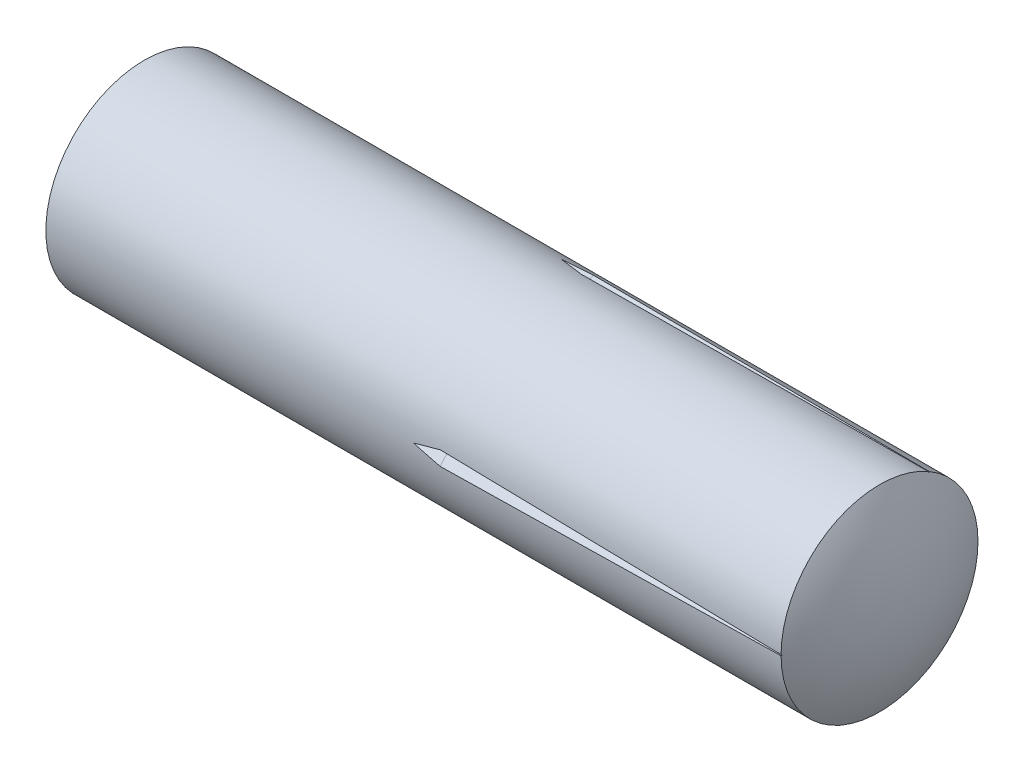
ISO-10303-21;
HEADER;
FILE_DESCRIPTION(('STEP AP214'),'2;1');
FILE_NAME('part.step','',(''),(''),'','','');
FILE_SCHEMA(('AUTOMOTIVE_DESIGN { 1 0 10303 214 1 1 1 1 }'));
ENDSEC;
DATA;
#1=APPLICATION_CONTEXT('core data for automotive mechanical design processes');
#2=APPLICATION_PROTOCOL_DEFINITION('international standard','automotive_design',2000,#1);
#3=PRODUCT_CONTEXT('',#1,'mechanical');
#4=PRODUCT('Part','Part','',(#3));
#5=PRODUCT_RELATED_PRODUCT_CATEGORY('part','',(#4));
#6=PRODUCT_DEFINITION_FORMATION('','',#4);
#7=PRODUCT_DEFINITION_CONTEXT('part definition',#1,'design');
#8=PRODUCT_DEFINITION('design','',#6,#7);
#9=PRODUCT_DEFINITION_SHAPE('','',#8);
#10=(LENGTH_UNIT() NAMED_UNIT(*) SI_UNIT(.MILLI.,.METRE.));
#11=(NAMED_UNIT(*) PLANE_ANGLE_UNIT() SI_UNIT($,.RADIAN.));
#12=(NAMED_UNIT(*) SI_UNIT($,.STERADIAN.) SOLID_ANGLE_UNIT());
#13=UNCERTAINTY_MEASURE_WITH_UNIT(LENGTH_MEASURE(1.E-05),#10,'distance_accuracy_value','');
#14=(GEOMETRIC_REPRESENTATION_CONTEXT(3) GLOBAL_UNCERTAINTY_ASSIGNED_CONTEXT((#13)) GLOBAL_UNIT_ASSIGNED_CONTEXT((#10,
#11,#12)) REPRESENTATION_CONTEXT('',''));
#15=CARTESIAN_POINT('',(0.,0.,0.));
#16=DIRECTION('',(0.,0.,1.));
#17=DIRECTION('',(1.,0.,0.));
#18=AXIS2_PLACEMENT_3D('',#15,#16,#17);
#19=CARTESIAN_POINT('',(-25.0312695557023,0.,0.));
#20=DIRECTION('',(-1.,0.,0.));
#21=DIRECTION('',(0.,1.,0.));
#22=AXIS2_PLACEMENT_3D('',#19,#20,#21);
#23=SPHERICAL_SURFACE('',#22,25.);
#24=CARTESIAN_POINT('',(-50.,0.,0.));
#25=DIRECTION('',(-1.,0.,0.));
#26=DIRECTION('',(0.,0.,1.));
#27=AXIS2_PLACEMENT_3D('',#24,#25,#26);
#28=CIRCLE('',#27,1.25);
#29=CARTESIAN_POINT('',(-50.,1.25000000000009,0.));
#30=VERTEX_POINT('',#29);
#31=EDGE_CURVE('E180',#30,#30,#28,.T.);
#32=CARTESIAN_POINT('',(-46.6819046503132,0.,0.));
#33=DIRECTION('',(-1.,0.,0.));
#34=DIRECTION('',(0.,0.,1.));
#35=AXIS2_PLACEMENT_3D('',#32,#33,#34);
#36=CIRCLE('',#35,12.5);
#37=CARTESIAN_POINT('',(-46.6819046503132,12.5,0.));
#38=VERTEX_POINT('',#37);
#39=EDGE_CURVE('E173',#38,#38,#36,.T.);
#40=CARTESIAN_POINT('',(-50.,1.25000000000009,0.));
#41=CARTESIAN_POINT('',(-49.9938336924778,1.37317333168647,0.));
#42=CARTESIAN_POINT('',(-49.9867558041352,1.49630102540885,0.));
#43=CARTESIAN_POINT('',(-49.9707787305738,1.74243819046344,0.));
#44=CARTESIAN_POINT('',(-49.9618795453548,1.86544766179563,0.));
#45=CARTESIAN_POINT('',(-49.942261742805,2.11132143560765,0.));
#46=CARTESIAN_POINT('',(-49.931543125474,2.23418573808748,0.));
#47=CARTESIAN_POINT('',(-49.9082888288313,2.47974226646468,0.));
#48=CARTESIAN_POINT('',(-49.8957531495194,2.60243449236206,0.));
#49=CARTESIAN_POINT('',(-49.8688674683718,2.84761999567275,0.));
#50=CARTESIAN_POINT('',(-49.854517466536,2.97011327308608,0.));
#51=CARTESIAN_POINT('',(-49.8240062848361,3.21487405159798,0.));
#52=CARTESIAN_POINT('',(-49.8078451049719,3.33714155269656,0.));
#53=CARTESIAN_POINT('',(-49.7737151063308,3.58142400006337,0.));
#54=CARTESIAN_POINT('',(-49.7557462875539,3.70343894633159,0.));
#55=CARTESIAN_POINT('',(-49.718004946655,3.94718956087127,0.));
#56=CARTESIAN_POINT('',(-49.698232424533,4.06892522914272,0.));
#57=CARTESIAN_POINT('',(-49.6568880074031,4.31209062567909,0.));
#58=CARTESIAN_POINT('',(-49.6353161123952,4.433520353944,0.));
#59=CARTESIAN_POINT('',(-49.5903776740829,4.67604727546572,0.));
#60=CARTESIAN_POINT('',(-49.5670111307785,4.79714446872253,0.));
#61=CARTESIAN_POINT('',(-49.5184885135079,5.03897979805612,0.));
#62=CARTESIAN_POINT('',(-49.4933324395417,5.15971793413291,0.));
#63=CARTESIAN_POINT('',(-49.4412362705202,5.40080870557385,0.));
#64=CARTESIAN_POINT('',(-49.414296175465,5.521161340938,0.));
#65=CARTESIAN_POINT('',(-49.3586378645657,5.76145475185168,0.));
#66=CARTESIAN_POINT('',(-49.3299196487216,5.8813955274012,0.));
#67=CARTESIAN_POINT('',(-49.2707113859815,6.12083894978735,0.));
#68=CARTESIAN_POINT('',(-49.2402213390854,6.24034159662397,0.));
#69=CARTESIAN_POINT('',(-49.1774760920364,6.47888258864305,0.));
#70=CARTESIAN_POINT('',(-49.1452208918834,6.59792093382551,0.));
#71=CARTESIAN_POINT('',(-49.078952402712,6.83550725128431,0.));
#72=CARTESIAN_POINT('',(-49.0449391136935,6.95405522356064,0.));
#73=CARTESIAN_POINT('',(-48.9751618962311,7.19063483135451,0.));
#74=CARTESIAN_POINT('',(-48.9393979677872,7.30866646687205,0.));
#75=CARTESIAN_POINT('',(-48.8661273043316,7.54418755038149,0.));
#76=CARTESIAN_POINT('',(-48.8286205693198,7.66167699837338,0.));
#77=CARTESIAN_POINT('',(-48.7518725072875,7.89608797481216,0.));
#78=CARTESIAN_POINT('',(-48.712631180267,8.01300950325904,0.));
#79=CARTESIAN_POINT('',(-48.6324225286792,8.24625903297168,0.));
#80=CARTESIAN_POINT('',(-48.5914552041119,8.36258703423744,0.));
#81=CARTESIAN_POINT('',(-48.5078035299129,8.59462403194338,0.));
#82=CARTESIAN_POINT('',(-48.4651191802811,8.71033302838357,0.));
#83=CARTESIAN_POINT('',(-48.3780428044906,8.94110667436572,0.));
#84=CARTESIAN_POINT('',(-48.3336507783319,9.05617132390769,0.));
#85=CARTESIAN_POINT('',(-48.2431687720324,9.28563107514239,0.));
#86=CARTESIAN_POINT('',(-48.1970787918916,9.40002617683512,0.));
#87=CARTESIAN_POINT('',(-48.1032109720534,9.62812177806314,0.));
#88=CARTESIAN_POINT('',(-48.055433132356,9.74182227759843,0.));
#89=CARTESIAN_POINT('',(-47.9582000574885,9.96850377232686,0.));
#90=CARTESIAN_POINT('',(-47.9087448223184,10.08148476752,0.));
#91=CARTESIAN_POINT('',(-47.8081677879997,10.3067025089814,0.));
#92=CARTESIAN_POINT('',(-47.7570459888512,10.4189392552497,0.));
#93=CARTESIAN_POINT('',(-47.653147022944,10.6426439172087,0.));
#94=CARTESIAN_POINT('',(-47.6003698561855,10.7541118328994,0.));
#95=CARTESIAN_POINT('',(-47.4931717144603,10.9762544207054,0.));
#96=CARTESIAN_POINT('',(-47.4387507394937,11.0869290928207,0.));
#97=CARTESIAN_POINT('',(-47.3282768989746,11.307460953207,0.));
#98=CARTESIAN_POINT('',(-47.272224033422,11.417318141478,0.));
#99=CARTESIAN_POINT('',(-47.1584986934783,11.6361909766944,0.));
#100=CARTESIAN_POINT('',(-47.1008262190871,11.7452066236399,0.));
#101=CARTESIAN_POINT('',(-46.9838742728691,11.9623724890545,0.));
#102=CARTESIAN_POINT('',(-46.9245948010422,12.0705227075236,0.));
#103=CARTESIAN_POINT('',(-46.8044419168537,12.2859340705523,0.));
#104=CARTESIAN_POINT('',(-46.743568504492,12.3931952151119,0.));
#105=CARTESIAN_POINT('',(-46.6819046503132,12.5,0.));
#106=B_SPLINE_CURVE_WITH_KNOTS('',3,(#40,#41,#42,#43,#44,#45,#46,#47,#48,#49,#50,#51,#52,#53,
#54,#55,#56,#57,#58,#59,#60,#61,#62,#63,#64,#65,#66,#67,#68,#69,#70,#71,#72,#73,#74,#75,#76,#77,
#78,#79,#80,#81,#82,#83,#84,#85,#86,#87,#88,#89,#90,#91,#92,#93,#94,#95,#96,#97,#98,#99,#100,
#101,#102,#103,#104,#105),.UNSPECIFIED.,.F.,.F.,(4,2,2,2,2,2,2,2,2,2,2,2,2,2,2,2,2,2,2,2,2,2,2,
2,2,2,2,2,2,2,2,2,4),(0.,0.369979372671549,0.739958745343092,1.10993811801464,1.47991749068618,
1.84989686335773,2.21987623602928,2.58985560870083,2.95983498137237,3.32981435404392,
3.69979372671547,4.06977309938701,4.43975247205856,4.8097318447301,5.17971121740165,
5.5496905900732,5.91966996274475,6.28964933541629,6.65962870808784,7.02960808075939,
7.39958745343093,7.76956682610248,8.13954619877402,8.50952557144557,8.87950494411712,
9.24948431678867,9.61946368946021,9.98944306213176,10.3594224348033,10.7294018074748,
11.0993811801464,11.4693605528179,11.8393399254895),.UNSPECIFIED.);
#107=EDGE_CURVE('BSEAM35',#30,#38,#106,.T.);
#108=ORIENTED_EDGE('',*,*,#31,.F.);
#109=ORIENTED_EDGE('',*,*,#39,.T.);
#110=ORIENTED_EDGE('',*,*,#107,.T.);
#111=ORIENTED_EDGE('',*,*,#107,.F.);
#112=EDGE_LOOP('',(#108,#110,#109,#111));
#113=FACE_BOUND('',#112,.T.);
#114=ADVANCED_FACE('F35',(#113),#23,.T.);
#115=CARTESIAN_POINT('',(-50.,0.,0.));
#116=DIRECTION('',(1.,0.,0.));
#117=DIRECTION('',(0.,0.,-1.));
#118=AXIS2_PLACEMENT_3D('',#115,#116,#117);
#119=PLANE('',#118);
#120=ORIENTED_EDGE('',*,*,#31,.T.);
#121=EDGE_LOOP('',(#120));
#122=FACE_BOUND('',#121,.T.);
#123=ADVANCED_FACE('F237',(#122),#119,.F.);
#124=CARTESIAN_POINT('',(25.,0.,0.));
#125=DIRECTION('',(-1.,0.,0.));
#126=DIRECTION('',(0.,1.,0.));
#127=AXIS2_PLACEMENT_3D('',#124,#125,#126);
#128=SPHERICAL_SURFACE('',#127,25.);
#129=CARTESIAN_POINT('',(46.6506350946109,0.,0.));
#130=DIRECTION('',(-1.,0.,0.));
#131=DIRECTION('',(0.,0.,1.));
#132=AXIS2_PLACEMENT_3D('',#129,#130,#131);
#133=CIRCLE('',#132,12.5);
#134=CARTESIAN_POINT('',(46.6506350946109,10.7915623473538,-6.30810447782654));
#135=VERTEX_POINT('',#134);
#136=CARTESIAN_POINT('',(46.6506350946109,-10.7915623473537,-6.30810447782669));
#137=VERTEX_POINT('',#136);
#138=EDGE_CURVE('E181',#135,#137,#133,.T.);
#139=ORIENTED_EDGE('',*,*,#138,.F.);
#140=CARTESIAN_POINT('',(24.8856783467141,6.55604170560393,2.78127333420719));
#141=DIRECTION('',(0.0160507401986912,-0.920467112956359,-0.390490291434833));
#142=DIRECTION('',(0.,0.390540601432779,-0.920585704121307));
#143=AXIS2_PLACEMENT_3D('',#140,#141,#142);
#144=CIRCLE('',#143,23.9639263551364);
#145=CARTESIAN_POINT('',(46.7011859340063,10.7491346997452,-6.20601581245332));
#146=VERTEX_POINT('',#145);
#147=EDGE_CURVE('E140',#135,#146,#144,.T.);
#148=ORIENTED_EDGE('',*,*,#147,.T.);
#149=CARTESIAN_POINT('',(24.8856783467141,0.869367490510428,-7.06833533242684));
#150=DIRECTION('',(0.0160507401986912,-0.122059044164444,0.992393048885741));
#151=DIRECTION('',(0.,-0.992520906846224,-0.122074770010633));
#152=AXIS2_PLACEMENT_3D('',#149,#150,#151);
#153=CIRCLE('',#152,23.9639263551364);
#154=CARTESIAN_POINT('',(46.6506350946109,10.8587599012012,-6.19171490041857));
#155=VERTEX_POINT('',#154);
#156=EDGE_CURVE('E126',#146,#155,#153,.T.);
#157=ORIENTED_EDGE('',*,*,#156,.T.);
#158=CARTESIAN_POINT('',(46.6506350946109,0.067197553847356,12.4998193782453));
#159=VERTEX_POINT('',#158);
#160=EDGE_CURVE('E177',#159,#155,#133,.T.);
#161=ORIENTED_EDGE('',*,*,#160,.F.);
#162=CARTESIAN_POINT('',(24.8856783467141,-5.68667421509359,4.28706199821972));
#163=DIRECTION('',(0.0160507401986912,0.798408068791928,-0.601902757450918));
#164=DIRECTION('',(0.,0.601980305413455,0.798510934110688));
#165=AXIS2_PLACEMENT_3D('',#162,#163,#164);
#166=CIRCLE('',#165,23.9639263551364);
#167=CARTESIAN_POINT('',(46.7011859340063,0.,12.4120316249068));
#168=VERTEX_POINT('',#167);
#169=EDGE_CURVE('E170',#159,#168,#166,.T.);
#170=ORIENTED_EDGE('',*,*,#169,.T.);
#171=CARTESIAN_POINT('',(24.8856783467141,5.6866742150936,4.28706199821973));
#172=DIRECTION('',(0.0160507401986912,-0.798408068791927,-0.601902757450918));
#173=DIRECTION('',(0.,0.601980305413455,-0.798510934110688));
#174=AXIS2_PLACEMENT_3D('',#171,#172,#173);
#175=CIRCLE('',#174,23.9639263551364);
#176=CARTESIAN_POINT('',(46.6506350946109,-0.0671975538473592,12.4998193782453));
#177=VERTEX_POINT('',#176);
#178=EDGE_CURVE('E167',#168,#177,#175,.T.);
#179=ORIENTED_EDGE('',*,*,#178,.T.);
#180=CARTESIAN_POINT('',(46.650635094611,-10.8587599012011,-6.19171490041872));
#181=VERTEX_POINT('',#180);
#182=EDGE_CURVE('E176',#181,#177,#133,.T.);
#183=ORIENTED_EDGE('',*,*,#182,.F.);
#184=CARTESIAN_POINT('',(24.8856783467141,-0.869367490510326,-7.06833533242685));
#185=DIRECTION('',(0.0160507401986912,0.12205904416443,0.992393048885743));
#186=DIRECTION('',(0.,-0.992520906846226,0.122074770010618));
#187=AXIS2_PLACEMENT_3D('',#184,#185,#186);
#188=CIRCLE('',#187,23.9639263551364);
#189=CARTESIAN_POINT('',(46.7011859340063,-10.7491346997451,-6.20601581245347));
#190=VERTEX_POINT('',#189);
#191=EDGE_CURVE('E154',#181,#190,#188,.T.);
#192=ORIENTED_EDGE('',*,*,#191,.T.);
#193=CARTESIAN_POINT('',(24.8856783467141,-6.55604170560397,2.78127333420709));
#194=DIRECTION('',(0.0160507401986912,0.920467112956364,-0.390490291434819));
#195=DIRECTION('',(0.,0.390540601432766,0.920585704121313));
#196=AXIS2_PLACEMENT_3D('',#193,#194,#195);
#197=CIRCLE('',#196,23.9639263551364);
#198=EDGE_CURVE('E151',#190,#137,#197,.T.);
#199=ORIENTED_EDGE('',*,*,#198,.T.);
#200=EDGE_LOOP('',(#139,#148,#157,#161,#170,#179,#183,#192,#199));
#201=FACE_BOUND('',#200,.T.);
#202=ADVANCED_FACE('F211',(#201),#128,.T.);
#203=CARTESIAN_POINT('',(-57.,0.,0.));
#204=DIRECTION('',(-1.,0.,0.));
#205=DIRECTION('',(0.,0.,1.));
#206=AXIS2_PLACEMENT_3D('',#203,#204,#205);
#207=CYLINDRICAL_SURFACE('',#206,12.5);
#208=ORIENTED_EDGE('',*,*,#39,.F.);
#209=EDGE_LOOP('',(#208));
#210=FACE_BOUND('',#209,.T.);
#211=CARTESIAN_POINT('',(31.25,0.,0.));
#212=DIRECTION('',(0.223620539334227,0.883356704074503,0.411915995992508));
#213=DIRECTION('',(-0.974676281843295,0.202669036139944,0.0945061236229502));
#214=AXIS2_PLACEMENT_3D('',#211,#212,#213);
#215=ELLIPSE('',#214,55.8982642525395,12.5);
#216=CARTESIAN_POINT('',(3.34252354154169,10.340007227626,-7.02383446079431));
#217=VERTEX_POINT('',#216);
#218=CARTESIAN_POINT('',(0.,10.8253175473055,-6.2499999999999));
#219=VERTEX_POINT('',#218);
#220=EDGE_CURVE('E136',#217,#219,#215,.T.);
#221=ORIENTED_EDGE('',*,*,#220,.F.);
#222=CARTESIAN_POINT('',(-418.749999999999,0.,0.));
#223=DIRECTION('',(0.0160507401986912,-0.920467112956359,-0.390490291434833));
#224=DIRECTION('',(-0.999871178572057,-0.0147760819674803,-0.00626846573063813));
#225=AXIS2_PLACEMENT_3D('',#222,#223,#224);
#226=ELLIPSE('',#225,778.780283355362,12.5);
#227=EDGE_CURVE('E12',#217,#135,#226,.T.);
#228=ORIENTED_EDGE('',*,*,#227,.T.);
#229=ORIENTED_EDGE('',*,*,#138,.T.);
#230=CARTESIAN_POINT('',(-418.749999999999,0.,0.));
#231=DIRECTION('',(0.0160507401986912,0.920467112956364,-0.390490291434819));
#232=DIRECTION('',(-0.999871178572057,0.0147760819674804,-0.00626846573063792));
#233=AXIS2_PLACEMENT_3D('',#230,#231,#232);
#234=ELLIPSE('',#233,778.780283355361,12.5);
#235=CARTESIAN_POINT('',(3.34252354154169,-10.3400072276259,-7.02383446079445));
#236=VERTEX_POINT('',#235);
#237=EDGE_CURVE('E199',#137,#236,#234,.T.);
#238=ORIENTED_EDGE('',*,*,#237,.T.);
#239=CARTESIAN_POINT('',(31.25,0.,0.));
#240=DIRECTION('',(0.223620539334227,-0.883356704074509,0.411915995992496));
#241=DIRECTION('',(-0.974676281843295,-0.202669036139946,0.0945061236229473));
#242=AXIS2_PLACEMENT_3D('',#239,#240,#241);
#243=ELLIPSE('',#242,55.8982642525395,12.5);
#244=CARTESIAN_POINT('',(0.,-10.8253175473055,-6.25000000000006));
#245=VERTEX_POINT('',#244);
#246=EDGE_CURVE('E195',#245,#236,#243,.T.);
#247=ORIENTED_EDGE('',*,*,#246,.F.);
#248=CARTESIAN_POINT('',(31.25,0.,0.));
#249=DIRECTION('',(0.223620539334226,-0.0849486352825749,-0.970967344328066));
#250=DIRECTION('',(-0.974676281843295,-0.0194898141993057,-0.222769595669173));
#251=AXIS2_PLACEMENT_3D('',#248,#249,#250);
#252=ELLIPSE('',#251,55.8982642525395,12.5);
#253=CARTESIAN_POINT('',(3.34252354154169,-11.2528226888375,-5.44279170404163));
#254=VERTEX_POINT('',#253);
#255=EDGE_CURVE('E197',#254,#245,#252,.T.);
#256=ORIENTED_EDGE('',*,*,#255,.F.);
#257=CARTESIAN_POINT('',(-418.75,0.,0.));
#258=DIRECTION('',(0.0160507401986912,0.12205904416443,0.992393048885743));
#259=DIRECTION('',(-0.999871178572057,0.00195939041825541,0.0159306952175581));
#260=AXIS2_PLACEMENT_3D('',#257,#258,#259);
#261=ELLIPSE('',#260,778.780283355362,12.5);
#262=EDGE_CURVE('E202',#254,#181,#261,.T.);
#263=ORIENTED_EDGE('',*,*,#262,.T.);
#264=ORIENTED_EDGE('',*,*,#182,.T.);
#265=CARTESIAN_POINT('',(-418.749999999999,0.,0.));
#266=DIRECTION('',(0.0160507401986912,-0.798408068791927,-0.601902757450918));
#267=DIRECTION('',(-0.999871178572057,-0.0128166915492249,-0.00966222948692014));
#268=AXIS2_PLACEMENT_3D('',#265,#266,#267);
#269=ELLIPSE('',#268,778.780283355361,12.5);
#270=CARTESIAN_POINT('',(3.34252354154169,-0.912815461211556,12.466626164836));
#271=VERTEX_POINT('',#270);
#272=EDGE_CURVE('E189',#177,#271,#269,.T.);
#273=ORIENTED_EDGE('',*,*,#272,.T.);
#274=CARTESIAN_POINT('',(31.25,0.,0.));
#275=DIRECTION('',(0.223620539334227,0.798408068791927,0.559051348335566));
#276=DIRECTION('',(-0.974676281843295,0.183179221940638,0.128263472046225));
#277=AXIS2_PLACEMENT_3D('',#274,#275,#276);
#278=ELLIPSE('',#277,55.8982642525395,12.5);
#279=CARTESIAN_POINT('',(0.,0.,12.5));
#280=VERTEX_POINT('',#279);
#281=EDGE_CURVE('E184',#280,#271,#278,.T.);
#282=ORIENTED_EDGE('',*,*,#281,.F.);
#283=CARTESIAN_POINT('',(31.25,0.,0.));
#284=DIRECTION('',(0.223620539334226,-0.798408068791928,0.559051348335566));
#285=DIRECTION('',(-0.974676281843295,-0.183179221940638,0.128263472046225));
#286=AXIS2_PLACEMENT_3D('',#283,#284,#285);
#287=ELLIPSE('',#286,55.8982642525395,12.5);
#288=CARTESIAN_POINT('',(3.34252354154169,0.912815461211552,12.466626164836));
#289=VERTEX_POINT('',#288);
#290=EDGE_CURVE('E186',#289,#280,#287,.T.);
#291=ORIENTED_EDGE('',*,*,#290,.F.);
#292=CARTESIAN_POINT('',(-418.75,0.,0.));
#293=DIRECTION('',(0.0160507401986912,0.798408068791928,-0.601902757450918));
#294=DIRECTION('',(-0.999871178572057,0.0128166915492248,-0.00966222948692012));
#295=AXIS2_PLACEMENT_3D('',#292,#293,#294);
#296=ELLIPSE('',#295,778.780283355362,12.5);
#297=EDGE_CURVE('E192',#289,#159,#296,.T.);
#298=ORIENTED_EDGE('',*,*,#297,.T.);
#299=ORIENTED_EDGE('',*,*,#160,.T.);
#300=CARTESIAN_POINT('',(-418.75,0.,0.));
#301=DIRECTION('',(0.0160507401986912,-0.122059044164444,0.992393048885741));
#302=DIRECTION('',(-0.999871178572057,-0.00195939041825564,0.0159306952175581));
#303=AXIS2_PLACEMENT_3D('',#300,#301,#302);
#304=ELLIPSE('',#303,778.780283355362,12.5);
#305=CARTESIAN_POINT('',(3.34252354154169,11.2528226888376,-5.44279170404147));
#306=VERTEX_POINT('',#305);
#307=EDGE_CURVE('E42',#155,#306,#304,.T.);
#308=ORIENTED_EDGE('',*,*,#307,.T.);
#309=CARTESIAN_POINT('',(31.25,0.,0.));
#310=DIRECTION('',(0.223620539334227,0.084948635282589,-0.970967344328065));
#311=DIRECTION('',(-0.974676281843295,0.0194898141993089,-0.222769595669173));
#312=AXIS2_PLACEMENT_3D('',#309,#310,#311);
#313=ELLIPSE('',#312,55.8982642525395,12.5);
#314=EDGE_CURVE('E116',#219,#306,#313,.T.);
#315=ORIENTED_EDGE('',*,*,#314,.F.);
#316=EDGE_LOOP('',(#221,#228,#229,#238,#247,#256,#263,#264,#273,#282,#291,#298,#299,#308,#315));
#317=FACE_BOUND('',#316,.T.);
#318=ADVANCED_FACE('F207',(#210,#317),#207,.T.);
#319=CARTESIAN_POINT('',(3.04669241827186,-0.328609817700259,10.8120195765467));
#320=DIRECTION('',(0.0160507401986912,0.798408068791928,-0.601902757450918));
#321=DIRECTION('',(0.,0.601980305413455,0.798510934110688));
#322=AXIS2_PLACEMENT_3D('',#319,#320,#321);
#323=PLANE('',#322);
#324=ORIENTED_EDGE('',*,*,#297,.F.);
#325=DIRECTION('',(0.141573937161921,0.594100656094854,0.791834092941278));
#326=VECTOR('',#325,1.);
#327=CARTESIAN_POINT('',(3.04669241827186,-0.328609817700259,10.8120195765467));
#328=LINE('',#327,#326);
#329=CARTESIAN_POINT('',(3.125,0.,11.25));
#330=VERTEX_POINT('',#329);
#331=EDGE_CURVE('E158',#330,#289,#328,.T.);
#332=ORIENTED_EDGE('',*,*,#331,.F.);
#333=DIRECTION('',(0.999644633961771,0.,0.0266571902389806));
#334=VECTOR('',#333,1.);
#335=CARTESIAN_POINT('',(3.125,0.,11.25));
#336=LINE('',#335,#334);
#337=EDGE_CURVE('E164',#330,#168,#336,.T.);
#338=ORIENTED_EDGE('',*,*,#337,.T.);
#339=ORIENTED_EDGE('',*,*,#169,.F.);
#340=EDGE_LOOP('',(#324,#332,#338,#339));
#341=FACE_BOUND('',#340,.T.);
#342=ADVANCED_FACE('F248',(#341),#323,.F.);
#343=CARTESIAN_POINT('',(3.04669241827186,0.328609817700257,10.8120195765467));
#344=DIRECTION('',(0.0160507401986912,-0.798408068791927,-0.601902757450918));
#345=DIRECTION('',(0.,0.601980305413455,-0.798510934110688));
#346=AXIS2_PLACEMENT_3D('',#343,#344,#345);
#347=PLANE('',#346);
#348=ORIENTED_EDGE('',*,*,#337,.F.);
#349=DIRECTION('',(-0.141573937161921,0.594100656094855,-0.791834092941277));
#350=VECTOR('',#349,1.);
#351=CARTESIAN_POINT('',(3.04669241827186,0.328609817700257,10.8120195765467));
#352=LINE('',#351,#350);
#353=EDGE_CURVE('E161',#271,#330,#352,.T.);
#354=ORIENTED_EDGE('',*,*,#353,.F.);
#355=ORIENTED_EDGE('',*,*,#272,.F.);
#356=ORIENTED_EDGE('',*,*,#178,.F.);
#357=EDGE_LOOP('',(#348,#354,#355,#356));
#358=FACE_BOUND('',#357,.T.);
#359=ADVANCED_FACE('F254',(#358),#347,.F.);
#360=CARTESIAN_POINT('',(6.28281228350407,0.,9.98687508659837));
#361=DIRECTION('',(0.223620539334226,-0.798408068791928,0.559051348335566));
#362=DIRECTION('',(0.,-0.573576436351047,-0.819152044288991));
#363=AXIS2_PLACEMENT_3D('',#360,#361,#362);
#364=PLANE('',#363);
#365=ORIENTED_EDGE('',*,*,#290,.T.);
#366=DIRECTION('',(-0.928476690885259,0.,0.371390676354104));
#367=VECTOR('',#366,1.);
#368=CARTESIAN_POINT('',(6.28281228350407,0.,9.98687508659837));
#369=LINE('',#368,#367);
#370=EDGE_CURVE('E157',#330,#280,#369,.T.);
#371=ORIENTED_EDGE('',*,*,#370,.F.);
#372=ORIENTED_EDGE('',*,*,#331,.T.);
#373=EDGE_LOOP('',(#365,#371,#372));
#374=FACE_BOUND('',#373,.T.);
#375=ADVANCED_FACE('F260',(#374),#364,.T.);
#376=CARTESIAN_POINT('',(6.28281228350407,0.,9.98687508659837));
#377=DIRECTION('',(0.223620539334227,0.798408068791927,0.559051348335566));
#378=DIRECTION('',(0.,-0.573576436351047,0.819152044288991));
#379=AXIS2_PLACEMENT_3D('',#376,#377,#378);
#380=PLANE('',#379);
#381=ORIENTED_EDGE('',*,*,#281,.T.);
#382=ORIENTED_EDGE('',*,*,#353,.T.);
#383=ORIENTED_EDGE('',*,*,#370,.T.);
#384=EDGE_LOOP('',(#381,#382,#383));
#385=FACE_BOUND('',#384,.T.);
#386=ADVANCED_FACE('F263',(#385),#380,.T.);
#387=CARTESIAN_POINT('',(3.04468501350222,-9.18524341313898,-5.69227573818436));
#388=DIRECTION('',(0.0160507401986912,0.12205904416443,0.992393048885743));
#389=DIRECTION('',(0.,-0.992520906846226,0.122074770010618));
#390=AXIS2_PLACEMENT_3D('',#387,#388,#389);
#391=PLANE('',#390);
#392=ORIENTED_EDGE('',*,*,#262,.F.);
#393=DIRECTION('',(0.141573937161921,-0.982798768117183,0.118589214112503));
#394=VECTOR('',#393,1.);
#395=CARTESIAN_POINT('',(3.04468501350222,-9.18524341313898,-5.69227573818436));
#396=LINE('',#395,#394);
#397=CARTESIAN_POINT('',(3.125,-9.74278579257491,-5.62500000000005));
#398=VERTEX_POINT('',#397);
#399=EDGE_CURVE('E142',#398,#254,#396,.T.);
#400=ORIENTED_EDGE('',*,*,#399,.F.);
#401=DIRECTION('',(0.999644633961771,-0.0230858039404717,-0.0133285951194904));
#402=VECTOR('',#401,1.);
#403=CARTESIAN_POINT('',(3.125,-9.74278579257491,-5.62500000000005));
#404=LINE('',#403,#402);
#405=EDGE_CURVE('E148',#398,#190,#404,.T.);
#406=ORIENTED_EDGE('',*,*,#405,.T.);
#407=ORIENTED_EDGE('',*,*,#191,.F.);
#408=EDGE_LOOP('',(#392,#400,#406,#407));
#409=FACE_BOUND('',#408,.T.);
#410=ADVANCED_FACE('F220',(#409),#391,.F.);
#411=CARTESIAN_POINT('',(3.04468501350222,-9.52227710118292,-5.10851626662995));
#412=DIRECTION('',(0.0160507401986912,0.920467112956364,-0.390490291434819));
#413=DIRECTION('',(0.,0.390540601432766,0.920585704121313));
#414=AXIS2_PLACEMENT_3D('',#411,#412,#413);
#415=PLANE('',#414);
#416=ORIENTED_EDGE('',*,*,#405,.F.);
#417=DIRECTION('',(-0.141573937161921,0.388698112022323,0.910423307053787));
#418=VECTOR('',#417,1.);
#419=CARTESIAN_POINT('',(3.04468501350222,-9.52227710118292,-5.10851626662995));
#420=LINE('',#419,#418);
#421=EDGE_CURVE('E145',#236,#398,#420,.T.);
#422=ORIENTED_EDGE('',*,*,#421,.F.);
#423=ORIENTED_EDGE('',*,*,#237,.F.);
#424=ORIENTED_EDGE('',*,*,#198,.F.);
#425=EDGE_LOOP('',(#416,#422,#423,#424));
#426=FACE_BOUND('',#425,.T.);
#427=ADVANCED_FACE('F217',(#426),#415,.F.);
#428=CARTESIAN_POINT('',(6.36376239458742,-8.62084558836114,-4.97724752108256));
#429=DIRECTION('',(0.223620539334226,-0.0849486352825749,-0.970967344328066));
#430=DIRECTION('',(-0.974489801655933,0.,-0.224431785780403));
#431=AXIS2_PLACEMENT_3D('',#428,#429,#430);
#432=PLANE('',#431);
#433=ORIENTED_EDGE('',*,*,#255,.T.);
#434=DIRECTION('',(-0.928476690885259,-0.321633760451338,-0.185695338177053));
#435=VECTOR('',#434,1.);
#436=CARTESIAN_POINT('',(6.36376239458742,-8.62084558836114,-4.97724752108256));
#437=LINE('',#436,#435);
#438=EDGE_CURVE('E57',#398,#245,#437,.T.);
#439=ORIENTED_EDGE('',*,*,#438,.F.);
#440=ORIENTED_EDGE('',*,*,#399,.T.);
#441=EDGE_LOOP('',(#433,#439,#440));
#442=FACE_BOUND('',#441,.T.);
#443=ADVANCED_FACE('F225',(#442),#432,.T.);
#444=CARTESIAN_POINT('',(6.36376239458742,-8.62084558836114,-4.97724752108256));
#445=DIRECTION('',(0.223620539334227,-0.883356704074509,0.411915995992496));
#446=DIRECTION('',(0.,-0.422618261740694,-0.906307787036653));
#447=AXIS2_PLACEMENT_3D('',#444,#445,#446);
#448=PLANE('',#447);
#449=ORIENTED_EDGE('',*,*,#246,.T.);
#450=ORIENTED_EDGE('',*,*,#421,.T.);
#451=ORIENTED_EDGE('',*,*,#438,.T.);
#452=EDGE_LOOP('',(#449,#450,#451));
#453=FACE_BOUND('',#452,.T.);
#454=ADVANCED_FACE('F227',(#453),#448,.T.);
#455=CARTESIAN_POINT('',(3.04468501350222,9.52227710118299,-5.10851626662981));
#456=DIRECTION('',(0.0160507401986912,-0.920467112956359,-0.390490291434833));
#457=DIRECTION('',(0.,0.390540601432779,-0.920585704121307));
#458=AXIS2_PLACEMENT_3D('',#455,#456,#457);
#459=PLANE('',#458);
#460=ORIENTED_EDGE('',*,*,#227,.F.);
#461=DIRECTION('',(0.141573937161921,0.388698112022336,-0.910423307053781));
#462=VECTOR('',#461,1.);
#463=CARTESIAN_POINT('',(3.04468501350222,9.52227710118299,-5.10851626662981));
#464=LINE('',#463,#462);
#465=CARTESIAN_POINT('',(3.125,9.74278579257499,-5.62499999999991));
#466=VERTEX_POINT('',#465);
#467=EDGE_CURVE('E120',#466,#217,#464,.T.);
#468=ORIENTED_EDGE('',*,*,#467,.F.);
#469=DIRECTION('',(0.999644633961771,0.0230858039404719,-0.0133285951194901));
#470=VECTOR('',#469,1.);
#471=CARTESIAN_POINT('',(3.125,9.74278579257499,-5.62499999999991));
#472=LINE('',#471,#470);
#473=EDGE_CURVE('E119',#466,#146,#472,.T.);
#474=ORIENTED_EDGE('',*,*,#473,.T.);
#475=ORIENTED_EDGE('',*,*,#147,.F.);
#476=EDGE_LOOP('',(#460,#468,#474,#475));
#477=FACE_BOUND('',#476,.T.);
#478=ADVANCED_FACE('F131',(#477),#459,.F.);
#479=CARTESIAN_POINT('',(3.04468501350222,9.18524341313906,-5.69227573818423));
#480=DIRECTION('',(0.0160507401986912,-0.122059044164444,0.992393048885741));
#481=DIRECTION('',(0.,-0.992520906846224,-0.122074770010633));
#482=AXIS2_PLACEMENT_3D('',#479,#480,#481);
#483=PLANE('',#482);
#484=ORIENTED_EDGE('',*,*,#473,.F.);
#485=DIRECTION('',(-0.141573937161921,-0.982798768117181,-0.118589214112517));
#486=VECTOR('',#485,1.);
#487=CARTESIAN_POINT('',(3.04468501350222,9.18524341313906,-5.69227573818423));
#488=LINE('',#487,#486);
#489=EDGE_CURVE('E112',#306,#466,#488,.T.);
#490=ORIENTED_EDGE('',*,*,#489,.F.);
#491=ORIENTED_EDGE('',*,*,#307,.F.);
#492=ORIENTED_EDGE('',*,*,#156,.F.);
#493=EDGE_LOOP('',(#484,#490,#491,#492));
#494=FACE_BOUND('',#493,.T.);
#495=ADVANCED_FACE('F124',(#494),#483,.F.);
#496=CARTESIAN_POINT('',(6.36376239458742,8.62084558836121,-4.97724752108243));
#497=DIRECTION('',(0.223620539334227,0.883356704074503,0.411915995992508));
#498=DIRECTION('',(0.,-0.422618261740707,0.906307787036646));
#499=AXIS2_PLACEMENT_3D('',#496,#497,#498);
#500=PLANE('',#499);
#501=ORIENTED_EDGE('',*,*,#220,.T.);
#502=DIRECTION('',(-0.928476690885259,0.32163376045134,-0.185695338177049));
#503=VECTOR('',#502,1.);
#504=CARTESIAN_POINT('',(6.36376239458742,8.62084558836121,-4.97724752108243));
#505=LINE('',#504,#503);
#506=EDGE_CURVE('E49',#466,#219,#505,.T.);
#507=ORIENTED_EDGE('',*,*,#506,.F.);
#508=ORIENTED_EDGE('',*,*,#467,.T.);
#509=EDGE_LOOP('',(#501,#507,#508));
#510=FACE_BOUND('',#509,.T.);
#511=ADVANCED_FACE('F135',(#510),#500,.T.);
#512=CARTESIAN_POINT('',(6.36376239458742,8.62084558836121,-4.97724752108243));
#513=DIRECTION('',(0.223620539334227,0.084948635282589,-0.970967344328065));
#514=DIRECTION('',(-0.974489801655933,0.,-0.224431785780403));
#515=AXIS2_PLACEMENT_3D('',#512,#513,#514);
#516=PLANE('',#515);
#517=ORIENTED_EDGE('',*,*,#314,.T.);
#518=ORIENTED_EDGE('',*,*,#489,.T.);
#519=ORIENTED_EDGE('',*,*,#506,.T.);
#520=EDGE_LOOP('',(#517,#518,#519));
#521=FACE_BOUND('',#520,.T.);
#522=ADVANCED_FACE('F114',(#521),#516,.T.);
#523=CLOSED_SHELL('',(#114,#123,#202,#318,#342,#359,#375,#386,#410,#427,#443,#454,#478,#495,
#511,#522));
#524=MANIFOLD_SOLID_BREP('B2',#523);
#525=ADVANCED_BREP_SHAPE_REPRESENTATION('',(#18,#524),#14);
#526=SHAPE_DEFINITION_REPRESENTATION(#9,#525);
ENDSEC;
END-ISO-10303-21;
